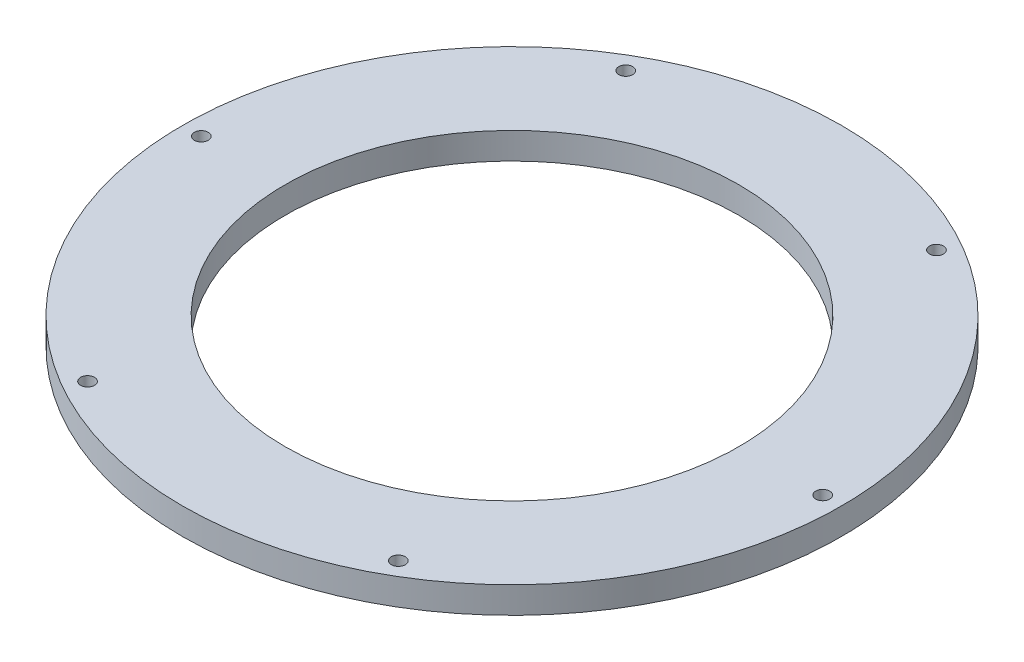
ISO-10303-21;
HEADER;
FILE_DESCRIPTION(('STEP AP214'),'2;1');
FILE_NAME('part.step','',(''),(''),'','','');
FILE_SCHEMA(('AUTOMOTIVE_DESIGN { 1 0 10303 214 1 1 1 1 }'));
ENDSEC;
DATA;
#1=APPLICATION_CONTEXT('core data for automotive mechanical design processes');
#2=APPLICATION_PROTOCOL_DEFINITION('international standard','automotive_design',2000,#1);
#3=PRODUCT_CONTEXT('',#1,'mechanical');
#4=PRODUCT('Part','Part','',(#3));
#5=PRODUCT_RELATED_PRODUCT_CATEGORY('part','',(#4));
#6=PRODUCT_DEFINITION_FORMATION('','',#4);
#7=PRODUCT_DEFINITION_CONTEXT('part definition',#1,'design');
#8=PRODUCT_DEFINITION('design','',#6,#7);
#9=PRODUCT_DEFINITION_SHAPE('','',#8);
#10=(LENGTH_UNIT() NAMED_UNIT(*) SI_UNIT(.MILLI.,.METRE.));
#11=(NAMED_UNIT(*) PLANE_ANGLE_UNIT() SI_UNIT($,.RADIAN.));
#12=(NAMED_UNIT(*) SI_UNIT($,.STERADIAN.) SOLID_ANGLE_UNIT());
#13=UNCERTAINTY_MEASURE_WITH_UNIT(LENGTH_MEASURE(1.E-05),#10,'distance_accuracy_value','');
#14=(GEOMETRIC_REPRESENTATION_CONTEXT(3) GLOBAL_UNCERTAINTY_ASSIGNED_CONTEXT((#13)) GLOBAL_UNIT_ASSIGNED_CONTEXT((#10,
#11,#12)) REPRESENTATION_CONTEXT('',''));
#15=CARTESIAN_POINT('',(0.,0.,0.));
#16=DIRECTION('',(0.,0.,1.));
#17=DIRECTION('',(1.,0.,0.));
#18=AXIS2_PLACEMENT_3D('',#15,#16,#17);
#19=CARTESIAN_POINT('',(0.,9.5,0.));
#20=DIRECTION('',(0.,1.,0.));
#21=DIRECTION('',(0.,0.,1.));
#22=AXIS2_PLACEMENT_3D('',#19,#20,#21);
#23=PLANE('',#22);
#24=CARTESIAN_POINT('',(111.249999999999,9.5,192.690652342038));
#25=DIRECTION('',(0.,1.,0.));
#26=DIRECTION('',(0.,0.,1.));
#27=AXIS2_PLACEMENT_3D('',#24,#25,#26);
#28=CIRCLE('',#27,5.00000000000001);
#29=CARTESIAN_POINT('',(111.249999999999,9.5,197.690652342038));
#30=VERTEX_POINT('',#29);
#31=EDGE_CURVE('E86',#30,#30,#28,.T.);
#32=ORIENTED_EDGE('',*,*,#31,.F.);
#33=EDGE_LOOP('',(#32));
#34=FACE_BOUND('',#33,.T.);
#35=CARTESIAN_POINT('',(-222.5,9.5,1.55431223447522E-12));
#36=DIRECTION('',(0.,1.,0.));
#37=DIRECTION('',(0.,0.,-1.));
#38=AXIS2_PLACEMENT_3D('',#35,#36,#37);
#39=CIRCLE('',#38,5.00000000000002);
#40=CARTESIAN_POINT('',(-222.5,9.5,-4.99999999999846));
#41=VERTEX_POINT('',#40);
#42=EDGE_CURVE('E95',#41,#41,#39,.T.);
#43=ORIENTED_EDGE('',*,*,#42,.F.);
#44=EDGE_LOOP('',(#43));
#45=FACE_BOUND('',#44,.T.);
#46=CARTESIAN_POINT('',(111.249999999999,9.5,-192.690652342038));
#47=DIRECTION('',(0.,1.,0.));
#48=DIRECTION('',(0.,0.,-1.));
#49=AXIS2_PLACEMENT_3D('',#46,#47,#48);
#50=CIRCLE('',#49,5.00000000000001);
#51=CARTESIAN_POINT('',(111.249999999999,9.5,-197.690652342038));
#52=VERTEX_POINT('',#51);
#53=EDGE_CURVE('E70',#52,#52,#50,.T.);
#54=ORIENTED_EDGE('',*,*,#53,.F.);
#55=EDGE_LOOP('',(#54));
#56=FACE_BOUND('',#55,.T.);
#57=CARTESIAN_POINT('',(222.5,9.5,0.));
#58=DIRECTION('',(0.,1.,0.));
#59=DIRECTION('',(0.,0.,1.));
#60=AXIS2_PLACEMENT_3D('',#57,#58,#59);
#61=CIRCLE('',#60,5.00000000000002);
#62=CARTESIAN_POINT('',(222.5,9.5,5.00000000000002));
#63=VERTEX_POINT('',#62);
#64=EDGE_CURVE('E79',#63,#63,#61,.T.);
#65=ORIENTED_EDGE('',*,*,#64,.F.);
#66=EDGE_LOOP('',(#65));
#67=FACE_BOUND('',#66,.T.);
#68=CARTESIAN_POINT('',(-111.25,9.5,192.690652342038));
#69=DIRECTION('',(0.,1.,0.));
#70=DIRECTION('',(0.,0.,-1.));
#71=AXIS2_PLACEMENT_3D('',#68,#69,#70);
#72=CIRCLE('',#71,5.00000000000001);
#73=CARTESIAN_POINT('',(-111.25,9.5,187.690652342038));
#74=VERTEX_POINT('',#73);
#75=EDGE_CURVE('E102',#74,#74,#72,.T.);
#76=ORIENTED_EDGE('',*,*,#75,.F.);
#77=EDGE_LOOP('',(#76));
#78=FACE_BOUND('',#77,.T.);
#79=CARTESIAN_POINT('',(-111.25,9.5,-192.690652342038));
#80=DIRECTION('',(0.,1.,0.));
#81=DIRECTION('',(0.,0.,1.));
#82=AXIS2_PLACEMENT_3D('',#79,#80,#81);
#83=CIRCLE('',#82,5.00000000000001);
#84=CARTESIAN_POINT('',(-111.25,9.5,-187.690652342038));
#85=VERTEX_POINT('',#84);
#86=EDGE_CURVE('E62',#85,#85,#83,.T.);
#87=ORIENTED_EDGE('',*,*,#86,.F.);
#88=EDGE_LOOP('',(#87));
#89=FACE_BOUND('',#88,.T.);
#90=CARTESIAN_POINT('',(0.,9.5,0.));
#91=DIRECTION('',(0.,1.,0.));
#92=DIRECTION('',(0.,0.,1.));
#93=AXIS2_PLACEMENT_3D('',#90,#91,#92);
#94=CIRCLE('',#93,236.);
#95=CARTESIAN_POINT('',(0.,9.5,236.));
#96=VERTEX_POINT('',#95);
#97=EDGE_CURVE('E10',#96,#96,#94,.T.);
#98=ORIENTED_EDGE('',*,*,#97,.T.);
#99=EDGE_LOOP('',(#98));
#100=FACE_BOUND('',#99,.T.);
#101=CARTESIAN_POINT('',(0.,9.5,0.));
#102=DIRECTION('',(0.,1.,0.));
#103=DIRECTION('',(0.,0.,1.));
#104=AXIS2_PLACEMENT_3D('',#101,#102,#103);
#105=CIRCLE('',#104,162.5);
#106=CARTESIAN_POINT('',(0.,9.5,162.5));
#107=VERTEX_POINT('',#106);
#108=EDGE_CURVE('E52',#107,#107,#105,.T.);
#109=ORIENTED_EDGE('',*,*,#108,.F.);
#110=EDGE_LOOP('',(#109));
#111=FACE_BOUND('',#110,.T.);
#112=ADVANCED_FACE('F39',(#34,#45,#56,#67,#78,#89,#100,#111),#23,.T.);
#113=CARTESIAN_POINT('',(0.,-9.5,0.));
#114=DIRECTION('',(0.,1.,0.));
#115=DIRECTION('',(0.,0.,1.));
#116=AXIS2_PLACEMENT_3D('',#113,#114,#115);
#117=PLANE('',#116);
#118=CARTESIAN_POINT('',(111.249999999999,-9.5,192.690652342038));
#119=DIRECTION('',(0.,1.,0.));
#120=DIRECTION('',(0.,0.,1.));
#121=AXIS2_PLACEMENT_3D('',#118,#119,#120);
#122=CIRCLE('',#121,5.00000000000001);
#123=CARTESIAN_POINT('',(111.249999999999,-9.5,197.690652342038));
#124=VERTEX_POINT('',#123);
#125=EDGE_CURVE('E90',#124,#124,#122,.T.);
#126=ORIENTED_EDGE('',*,*,#125,.T.);
#127=EDGE_LOOP('',(#126));
#128=FACE_BOUND('',#127,.T.);
#129=CARTESIAN_POINT('',(-222.5,-9.5,1.55431223447522E-12));
#130=DIRECTION('',(0.,1.,0.));
#131=DIRECTION('',(0.,0.,-1.));
#132=AXIS2_PLACEMENT_3D('',#129,#130,#131);
#133=CIRCLE('',#132,5.00000000000002);
#134=CARTESIAN_POINT('',(-222.5,-9.5,-4.99999999999846));
#135=VERTEX_POINT('',#134);
#136=EDGE_CURVE('E75',#135,#135,#133,.T.);
#137=ORIENTED_EDGE('',*,*,#136,.T.);
#138=EDGE_LOOP('',(#137));
#139=FACE_BOUND('',#138,.T.);
#140=CARTESIAN_POINT('',(111.249999999999,-9.5,-192.690652342038));
#141=DIRECTION('',(0.,1.,0.));
#142=DIRECTION('',(0.,0.,-1.));
#143=AXIS2_PLACEMENT_3D('',#140,#141,#142);
#144=CIRCLE('',#143,5.00000000000001);
#145=CARTESIAN_POINT('',(111.249999999999,-9.5,-197.690652342038));
#146=VERTEX_POINT('',#145);
#147=EDGE_CURVE('E74',#146,#146,#144,.T.);
#148=ORIENTED_EDGE('',*,*,#147,.T.);
#149=EDGE_LOOP('',(#148));
#150=FACE_BOUND('',#149,.T.);
#151=CARTESIAN_POINT('',(222.5,-9.5,0.));
#152=DIRECTION('',(0.,1.,0.));
#153=DIRECTION('',(0.,0.,1.));
#154=AXIS2_PLACEMENT_3D('',#151,#152,#153);
#155=CIRCLE('',#154,5.00000000000002);
#156=CARTESIAN_POINT('',(222.5,-9.5,5.00000000000002));
#157=VERTEX_POINT('',#156);
#158=EDGE_CURVE('E66',#157,#157,#155,.T.);
#159=ORIENTED_EDGE('',*,*,#158,.T.);
#160=EDGE_LOOP('',(#159));
#161=FACE_BOUND('',#160,.T.);
#162=CARTESIAN_POINT('',(-111.25,-9.5,192.690652342038));
#163=DIRECTION('',(0.,1.,0.));
#164=DIRECTION('',(0.,0.,-1.));
#165=AXIS2_PLACEMENT_3D('',#162,#163,#164);
#166=CIRCLE('',#165,5.00000000000001);
#167=CARTESIAN_POINT('',(-111.25,-9.5,187.690652342038));
#168=VERTEX_POINT('',#167);
#169=EDGE_CURVE('E91',#168,#168,#166,.T.);
#170=ORIENTED_EDGE('',*,*,#169,.T.);
#171=EDGE_LOOP('',(#170));
#172=FACE_BOUND('',#171,.T.);
#173=CARTESIAN_POINT('',(-111.25,-9.5,-192.690652342038));
#174=DIRECTION('',(0.,1.,0.));
#175=DIRECTION('',(0.,0.,1.));
#176=AXIS2_PLACEMENT_3D('',#173,#174,#175);
#177=CIRCLE('',#176,5.00000000000001);
#178=CARTESIAN_POINT('',(-111.25,-9.5,-187.690652342038));
#179=VERTEX_POINT('',#178);
#180=EDGE_CURVE('E58',#179,#179,#177,.T.);
#181=ORIENTED_EDGE('',*,*,#180,.T.);
#182=EDGE_LOOP('',(#181));
#183=FACE_BOUND('',#182,.T.);
#184=CARTESIAN_POINT('',(0.,-9.5,0.));
#185=DIRECTION('',(0.,1.,0.));
#186=DIRECTION('',(0.,0.,1.));
#187=AXIS2_PLACEMENT_3D('',#184,#185,#186);
#188=CIRCLE('',#187,236.);
#189=CARTESIAN_POINT('',(0.,-9.5,236.));
#190=VERTEX_POINT('',#189);
#191=EDGE_CURVE('E43',#190,#190,#188,.T.);
#192=ORIENTED_EDGE('',*,*,#191,.F.);
#193=EDGE_LOOP('',(#192));
#194=FACE_BOUND('',#193,.T.);
#195=CARTESIAN_POINT('',(0.,-9.5,0.));
#196=DIRECTION('',(0.,1.,0.));
#197=DIRECTION('',(0.,0.,1.));
#198=AXIS2_PLACEMENT_3D('',#195,#196,#197);
#199=CIRCLE('',#198,162.5);
#200=CARTESIAN_POINT('',(0.,-9.5,162.5));
#201=VERTEX_POINT('',#200);
#202=EDGE_CURVE('E54',#201,#201,#199,.T.);
#203=ORIENTED_EDGE('',*,*,#202,.T.);
#204=EDGE_LOOP('',(#203));
#205=FACE_BOUND('',#204,.T.);
#206=ADVANCED_FACE('F110',(#128,#139,#150,#161,#172,#183,#194,#205),#117,.F.);
#207=CARTESIAN_POINT('',(0.,9.5,0.));
#208=DIRECTION('',(0.,-1.,0.));
#209=DIRECTION('',(0.,0.,-1.));
#210=AXIS2_PLACEMENT_3D('',#207,#208,#209);
#211=CYLINDRICAL_SURFACE('',#210,236.);
#212=ORIENTED_EDGE('',*,*,#97,.F.);
#213=EDGE_LOOP('',(#212));
#214=FACE_BOUND('',#213,.T.);
#215=ORIENTED_EDGE('',*,*,#191,.T.);
#216=EDGE_LOOP('',(#215));
#217=FACE_BOUND('',#216,.T.);
#218=ADVANCED_FACE('F41',(#214,#217),#211,.T.);
#219=CARTESIAN_POINT('',(0.,9.5,0.));
#220=DIRECTION('',(0.,-1.,0.));
#221=DIRECTION('',(0.,0.,-1.));
#222=AXIS2_PLACEMENT_3D('',#219,#220,#221);
#223=CYLINDRICAL_SURFACE('',#222,162.5);
#224=ORIENTED_EDGE('',*,*,#108,.T.);
#225=EDGE_LOOP('',(#224));
#226=FACE_BOUND('',#225,.T.);
#227=ORIENTED_EDGE('',*,*,#202,.F.);
#228=EDGE_LOOP('',(#227));
#229=FACE_BOUND('',#228,.T.);
#230=ADVANCED_FACE('F129',(#226,#229),#223,.F.);
#231=CARTESIAN_POINT('',(-111.25,-9.5,-192.690652342038));
#232=DIRECTION('',(0.,1.,0.));
#233=DIRECTION('',(0.,0.,1.));
#234=AXIS2_PLACEMENT_3D('',#231,#232,#233);
#235=CYLINDRICAL_SURFACE('',#234,5.00000000000001);
#236=ORIENTED_EDGE('',*,*,#180,.F.);
#237=EDGE_LOOP('',(#236));
#238=FACE_BOUND('',#237,.T.);
#239=ORIENTED_EDGE('',*,*,#86,.T.);
#240=EDGE_LOOP('',(#239));
#241=FACE_BOUND('',#240,.T.);
#242=ADVANCED_FACE('F117',(#238,#241),#235,.F.);
#243=CARTESIAN_POINT('',(-111.25,-9.5,192.690652342038));
#244=DIRECTION('',(0.,1.,0.));
#245=DIRECTION('',(0.,0.,1.));
#246=AXIS2_PLACEMENT_3D('',#243,#244,#245);
#247=CYLINDRICAL_SURFACE('',#246,5.00000000000001);
#248=ORIENTED_EDGE('',*,*,#169,.F.);
#249=EDGE_LOOP('',(#248));
#250=FACE_BOUND('',#249,.T.);
#251=ORIENTED_EDGE('',*,*,#75,.T.);
#252=EDGE_LOOP('',(#251));
#253=FACE_BOUND('',#252,.T.);
#254=ADVANCED_FACE('F113',(#250,#253),#247,.F.);
#255=CARTESIAN_POINT('',(222.5,-9.5,0.));
#256=DIRECTION('',(0.,1.,0.));
#257=DIRECTION('',(0.,0.,1.));
#258=AXIS2_PLACEMENT_3D('',#255,#256,#257);
#259=CYLINDRICAL_SURFACE('',#258,5.00000000000002);
#260=ORIENTED_EDGE('',*,*,#158,.F.);
#261=EDGE_LOOP('',(#260));
#262=FACE_BOUND('',#261,.T.);
#263=ORIENTED_EDGE('',*,*,#64,.T.);
#264=EDGE_LOOP('',(#263));
#265=FACE_BOUND('',#264,.T.);
#266=ADVANCED_FACE('F116',(#262,#265),#259,.F.);
#267=CARTESIAN_POINT('',(111.249999999999,-9.5,-192.690652342038));
#268=DIRECTION('',(0.,1.,0.));
#269=DIRECTION('',(0.,0.,1.));
#270=AXIS2_PLACEMENT_3D('',#267,#268,#269);
#271=CYLINDRICAL_SURFACE('',#270,5.00000000000001);
#272=ORIENTED_EDGE('',*,*,#147,.F.);
#273=EDGE_LOOP('',(#272));
#274=FACE_BOUND('',#273,.T.);
#275=ORIENTED_EDGE('',*,*,#53,.T.);
#276=EDGE_LOOP('',(#275));
#277=FACE_BOUND('',#276,.T.);
#278=ADVANCED_FACE('F146',(#274,#277),#271,.F.);
#279=CARTESIAN_POINT('',(-222.5,-9.5,1.55431223447522E-12));
#280=DIRECTION('',(0.,1.,0.));
#281=DIRECTION('',(0.,0.,1.));
#282=AXIS2_PLACEMENT_3D('',#279,#280,#281);
#283=CYLINDRICAL_SURFACE('',#282,5.00000000000002);
#284=ORIENTED_EDGE('',*,*,#136,.F.);
#285=EDGE_LOOP('',(#284));
#286=FACE_BOUND('',#285,.T.);
#287=ORIENTED_EDGE('',*,*,#42,.T.);
#288=EDGE_LOOP('',(#287));
#289=FACE_BOUND('',#288,.T.);
#290=ADVANCED_FACE('F149',(#286,#289),#283,.F.);
#291=CARTESIAN_POINT('',(111.249999999999,-9.5,192.690652342038));
#292=DIRECTION('',(0.,1.,0.));
#293=DIRECTION('',(0.,0.,1.));
#294=AXIS2_PLACEMENT_3D('',#291,#292,#293);
#295=CYLINDRICAL_SURFACE('',#294,5.00000000000001);
#296=ORIENTED_EDGE('',*,*,#125,.F.);
#297=EDGE_LOOP('',(#296));
#298=FACE_BOUND('',#297,.T.);
#299=ORIENTED_EDGE('',*,*,#31,.T.);
#300=EDGE_LOOP('',(#299));
#301=FACE_BOUND('',#300,.T.);
#302=ADVANCED_FACE('F154',(#298,#301),#295,.F.);
#303=CLOSED_SHELL('',(#112,#206,#218,#230,#242,#254,#266,#278,#290,#302));
#304=MANIFOLD_SOLID_BREP('B2',#303);
#305=ADVANCED_BREP_SHAPE_REPRESENTATION('',(#18,#304),#14);
#306=SHAPE_DEFINITION_REPRESENTATION(#9,#305);
ENDSEC;
END-ISO-10303-21;
